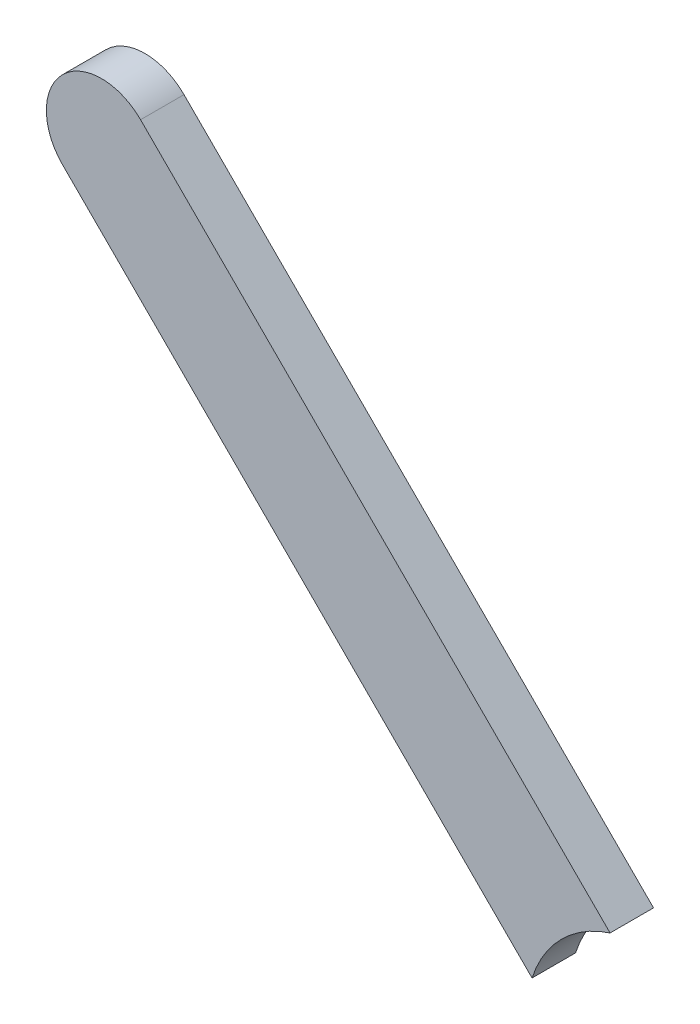
ISO-10303-21;
HEADER;
FILE_DESCRIPTION(('STEP AP214'),'2;1');
FILE_NAME('part.step','',(''),(''),'','','');
FILE_SCHEMA(('AUTOMOTIVE_DESIGN { 1 0 10303 214 1 1 1 1 }'));
ENDSEC;
DATA;
#1=APPLICATION_CONTEXT('core data for automotive mechanical design processes');
#2=APPLICATION_PROTOCOL_DEFINITION('international standard','automotive_design',2000,#1);
#3=PRODUCT_CONTEXT('',#1,'mechanical');
#4=PRODUCT('Part','Part','',(#3));
#5=PRODUCT_RELATED_PRODUCT_CATEGORY('part','',(#4));
#6=PRODUCT_DEFINITION_FORMATION('','',#4);
#7=PRODUCT_DEFINITION_CONTEXT('part definition',#1,'design');
#8=PRODUCT_DEFINITION('design','',#6,#7);
#9=PRODUCT_DEFINITION_SHAPE('','',#8);
#10=(LENGTH_UNIT() NAMED_UNIT(*) SI_UNIT(.MILLI.,.METRE.));
#11=(NAMED_UNIT(*) PLANE_ANGLE_UNIT() SI_UNIT($,.RADIAN.));
#12=(NAMED_UNIT(*) SI_UNIT($,.STERADIAN.) SOLID_ANGLE_UNIT());
#13=UNCERTAINTY_MEASURE_WITH_UNIT(LENGTH_MEASURE(1.E-05),#10,'distance_accuracy_value','');
#14=(GEOMETRIC_REPRESENTATION_CONTEXT(3) GLOBAL_UNCERTAINTY_ASSIGNED_CONTEXT((#13)) GLOBAL_UNIT_ASSIGNED_CONTEXT((#10,
#11,#12)) REPRESENTATION_CONTEXT('',''));
#15=CARTESIAN_POINT('',(0.,0.,0.));
#16=DIRECTION('',(0.,0.,1.));
#17=DIRECTION('',(1.,0.,0.));
#18=AXIS2_PLACEMENT_3D('',#15,#16,#17);
#19=CARTESIAN_POINT('',(126.33447174,101.01005706,0.));
#20=DIRECTION('',(0.707106781186548,0.707106781186548,0.));
#21=DIRECTION('',(0.707106781186548,-0.707106781186548,0.));
#22=AXIS2_PLACEMENT_3D('',#19,#20,#21);
#23=PLANE('',#22);
#24=DIRECTION('',(0.707106781186548,-0.707106781186548,0.));
#25=VECTOR('',#24,1.);
#26=CARTESIAN_POINT('',(126.33447174,101.01005706,0.1999996));
#27=LINE('',#26,#25);
#28=CARTESIAN_POINT('',(126.33447174,101.01005706,0.1999996));
#29=VERTEX_POINT('',#28);
#30=CARTESIAN_POINT('',(128.496197811456,98.8483309885438,0.1999996));
#31=VERTEX_POINT('',#30);
#32=EDGE_CURVE('E11',#29,#31,#27,.T.);
#33=ORIENTED_EDGE('',*,*,#32,.F.);
#34=DIRECTION('',(0.,0.,1.));
#35=VECTOR('',#34,1.);
#36=CARTESIAN_POINT('',(126.33447174,101.01005706,0.));
#37=LINE('',#36,#35);
#38=CARTESIAN_POINT('',(126.33447174,101.01005706,0.));
#39=VERTEX_POINT('',#38);
#40=EDGE_CURVE('E24',#39,#29,#37,.T.);
#41=ORIENTED_EDGE('',*,*,#40,.F.);
#42=DIRECTION('',(0.707106781186548,-0.707106781186548,0.));
#43=VECTOR('',#42,1.);
#44=CARTESIAN_POINT('',(126.33447174,101.01005706,0.));
#45=LINE('',#44,#43);
#46=CARTESIAN_POINT('',(128.496197811456,98.8483309885438,0.));
#47=VERTEX_POINT('',#46);
#48=EDGE_CURVE('E75',#39,#47,#45,.T.);
#49=ORIENTED_EDGE('',*,*,#48,.T.);
#50=DIRECTION('',(0.,0.,1.));
#51=VECTOR('',#50,1.);
#52=CARTESIAN_POINT('',(128.496197811456,98.8483309885438,0.));
#53=LINE('',#52,#51);
#54=EDGE_CURVE('E37',#47,#31,#53,.T.);
#55=ORIENTED_EDGE('',*,*,#54,.T.);
#56=EDGE_LOOP('',(#33,#41,#49,#55));
#57=FACE_BOUND('',#56,.T.);
#58=ADVANCED_FACE('F17',(#57),#23,.F.);
#59=CARTESIAN_POINT('',(129.0247356,98.679,0.));
#60=DIRECTION('',(0.,0.,-1.));
#61=DIRECTION('',(1.,0.,0.));
#62=AXIS2_PLACEMENT_3D('',#59,#60,#61);
#63=CYLINDRICAL_SURFACE('',#62,0.55500016);
#64=DIRECTION('',(0.,0.,1.));
#65=VECTOR('',#64,1.);
#66=CARTESIAN_POINT('',(128.855408458856,99.2075390211441,0.));
#67=LINE('',#66,#65);
#68=CARTESIAN_POINT('',(128.855408458856,99.2075390211441,0.));
#69=VERTEX_POINT('',#68);
#70=CARTESIAN_POINT('',(128.855408458856,99.2075390211441,0.1999996));
#71=VERTEX_POINT('',#70);
#72=EDGE_CURVE('E67',#69,#71,#67,.T.);
#73=ORIENTED_EDGE('',*,*,#72,.T.);
#74=CARTESIAN_POINT('',(129.0247356,98.679,0.1999996));
#75=DIRECTION('',(0.,0.,1.));
#76=DIRECTION('',(1.,0.,0.));
#77=AXIS2_PLACEMENT_3D('',#74,#75,#76);
#78=CIRCLE('',#77,0.55500016);
#79=EDGE_CURVE('E82',#71,#31,#78,.T.);
#80=ORIENTED_EDGE('',*,*,#79,.T.);
#81=ORIENTED_EDGE('',*,*,#54,.F.);
#82=CARTESIAN_POINT('',(129.0247356,98.679,0.));
#83=DIRECTION('',(0.,0.,1.));
#84=DIRECTION('',(1.,0.,0.));
#85=AXIS2_PLACEMENT_3D('',#82,#83,#84);
#86=CIRCLE('',#85,0.55500016);
#87=EDGE_CURVE('E80',#69,#47,#86,.T.);
#88=ORIENTED_EDGE('',*,*,#87,.F.);
#89=EDGE_LOOP('',(#73,#80,#81,#88));
#90=FACE_BOUND('',#89,.T.);
#91=ADVANCED_FACE('F88',(#90),#63,.F.);
#92=CARTESIAN_POINT('',(128.855408458856,99.2075390211441,0.));
#93=DIRECTION('',(-0.707106781186548,-0.707106781186548,0.));
#94=DIRECTION('',(-0.707106781186548,0.707106781186548,0.));
#95=AXIS2_PLACEMENT_3D('',#92,#93,#94);
#96=PLANE('',#95);
#97=DIRECTION('',(-0.707106781186548,0.707106781186548,0.));
#98=VECTOR('',#97,1.);
#99=CARTESIAN_POINT('',(129.20434154,98.85860594,0.1999996));
#100=LINE('',#99,#98);
#101=CARTESIAN_POINT('',(126.69368108,101.3692664,0.1999996));
#102=VERTEX_POINT('',#101);
#103=EDGE_CURVE('E71',#71,#102,#100,.T.);
#104=ORIENTED_EDGE('',*,*,#103,.F.);
#105=ORIENTED_EDGE('',*,*,#72,.F.);
#106=DIRECTION('',(-0.707106781186548,0.707106781186548,0.));
#107=VECTOR('',#106,1.);
#108=CARTESIAN_POINT('',(129.20434154,98.85860594,0.));
#109=LINE('',#108,#107);
#110=CARTESIAN_POINT('',(126.69368108,101.3692664,0.));
#111=VERTEX_POINT('',#110);
#112=EDGE_CURVE('E63',#69,#111,#109,.T.);
#113=ORIENTED_EDGE('',*,*,#112,.T.);
#114=DIRECTION('',(0.,0.,1.));
#115=VECTOR('',#114,1.);
#116=CARTESIAN_POINT('',(126.69368108,101.3692664,0.));
#117=LINE('',#116,#115);
#118=EDGE_CURVE('E53',#111,#102,#117,.T.);
#119=ORIENTED_EDGE('',*,*,#118,.T.);
#120=EDGE_LOOP('',(#104,#105,#113,#119));
#121=FACE_BOUND('',#120,.T.);
#122=ADVANCED_FACE('F66',(#121),#96,.F.);
#123=CARTESIAN_POINT('',(126.51407641,101.18966173,0.));
#124=DIRECTION('',(0.,0.,-1.));
#125=DIRECTION('',(0.70710678118652,0.707106781186576,0.));
#126=AXIS2_PLACEMENT_3D('',#123,#124,#125);
#127=CYLINDRICAL_SURFACE('',#126,0.253999360179546);
#128=CARTESIAN_POINT('',(126.51407641,101.18966173,0.1999996));
#129=DIRECTION('',(0.,0.,1.));
#130=DIRECTION('',(0.70710678118652,0.707106781186576,0.));
#131=AXIS2_PLACEMENT_3D('',#128,#129,#130);
#132=CIRCLE('',#131,0.253999360179546);
#133=EDGE_CURVE('E59',#102,#29,#132,.T.);
#134=ORIENTED_EDGE('',*,*,#133,.F.);
#135=ORIENTED_EDGE('',*,*,#118,.F.);
#136=CARTESIAN_POINT('',(126.51407641,101.18966173,0.));
#137=DIRECTION('',(0.,0.,1.));
#138=DIRECTION('',(0.70710678118652,0.707106781186576,0.));
#139=AXIS2_PLACEMENT_3D('',#136,#137,#138);
#140=CIRCLE('',#139,0.253999360179546);
#141=EDGE_CURVE('E57',#111,#39,#140,.T.);
#142=ORIENTED_EDGE('',*,*,#141,.T.);
#143=ORIENTED_EDGE('',*,*,#40,.T.);
#144=EDGE_LOOP('',(#134,#135,#142,#143));
#145=FACE_BOUND('',#144,.T.);
#146=ADVANCED_FACE('F55',(#145),#127,.T.);
#147=CARTESIAN_POINT('',(126.33447174,101.01005706,0.));
#148=DIRECTION('',(0.,0.,-1.));
#149=DIRECTION('',(-1.,0.,0.));
#150=AXIS2_PLACEMENT_3D('',#147,#148,#149);
#151=PLANE('',#150);
#152=ORIENTED_EDGE('',*,*,#48,.F.);
#153=ORIENTED_EDGE('',*,*,#141,.F.);
#154=ORIENTED_EDGE('',*,*,#112,.F.);
#155=ORIENTED_EDGE('',*,*,#87,.T.);
#156=EDGE_LOOP('',(#152,#153,#154,#155));
#157=FACE_BOUND('',#156,.T.);
#158=ADVANCED_FACE('F74',(#157),#151,.T.);
#159=CARTESIAN_POINT('',(126.33447174,101.01005706,0.1999996));
#160=DIRECTION('',(0.,0.,-1.));
#161=DIRECTION('',(-1.,0.,0.));
#162=AXIS2_PLACEMENT_3D('',#159,#160,#161);
#163=PLANE('',#162);
#164=ORIENTED_EDGE('',*,*,#133,.T.);
#165=ORIENTED_EDGE('',*,*,#32,.T.);
#166=ORIENTED_EDGE('',*,*,#79,.F.);
#167=ORIENTED_EDGE('',*,*,#103,.T.);
#168=EDGE_LOOP('',(#164,#165,#166,#167));
#169=FACE_BOUND('',#168,.T.);
#170=ADVANCED_FACE('F91',(#169),#163,.F.);
#171=CLOSED_SHELL('',(#58,#91,#122,#146,#158,#170));
#172=MANIFOLD_SOLID_BREP('B1',#171);
#173=ADVANCED_BREP_SHAPE_REPRESENTATION('',(#18,#172),#14);
#174=SHAPE_DEFINITION_REPRESENTATION(#9,#173);
ENDSEC;
END-ISO-10303-21;
